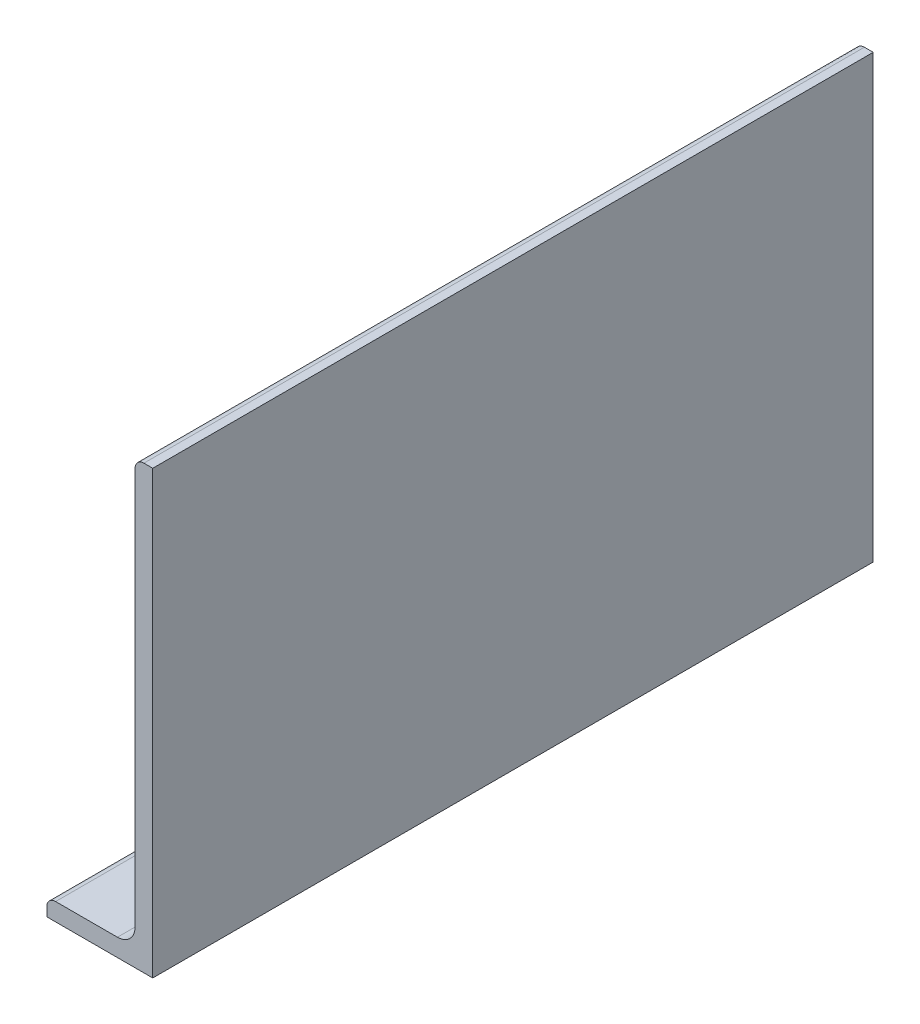
ISO-10303-21;
HEADER;
FILE_DESCRIPTION(('STEP AP214'),'2;1');
FILE_NAME('part.step','',(''),(''),'','','');
FILE_SCHEMA(('AUTOMOTIVE_DESIGN { 1 0 10303 214 1 1 1 1 }'));
ENDSEC;
DATA;
#1=APPLICATION_CONTEXT('core data for automotive mechanical design processes');
#2=APPLICATION_PROTOCOL_DEFINITION('international standard','automotive_design',2000,#1);
#3=PRODUCT_CONTEXT('',#1,'mechanical');
#4=PRODUCT('Part','Part','',(#3));
#5=PRODUCT_RELATED_PRODUCT_CATEGORY('part','',(#4));
#6=PRODUCT_DEFINITION_FORMATION('','',#4);
#7=PRODUCT_DEFINITION_CONTEXT('part definition',#1,'design');
#8=PRODUCT_DEFINITION('design','',#6,#7);
#9=PRODUCT_DEFINITION_SHAPE('','',#8);
#10=(LENGTH_UNIT() NAMED_UNIT(*) SI_UNIT(.MILLI.,.METRE.));
#11=(NAMED_UNIT(*) PLANE_ANGLE_UNIT() SI_UNIT($,.RADIAN.));
#12=(NAMED_UNIT(*) SI_UNIT($,.STERADIAN.) SOLID_ANGLE_UNIT());
#13=UNCERTAINTY_MEASURE_WITH_UNIT(LENGTH_MEASURE(1.E-05),#10,'distance_accuracy_value','');
#14=(GEOMETRIC_REPRESENTATION_CONTEXT(3) GLOBAL_UNCERTAINTY_ASSIGNED_CONTEXT((#13)) GLOBAL_UNIT_ASSIGNED_CONTEXT((#10,
#11,#12)) REPRESENTATION_CONTEXT('',''));
#15=CARTESIAN_POINT('',(0.,0.,0.));
#16=DIRECTION('',(0.,0.,1.));
#17=DIRECTION('',(1.,0.,0.));
#18=AXIS2_PLACEMENT_3D('',#15,#16,#17);
#19=CARTESIAN_POINT('',(1154.01935593196,-193.24771494514,81.6));
#20=DIRECTION('',(0.,-1.,0.));
#21=DIRECTION('',(0.,0.,-1.));
#22=AXIS2_PLACEMENT_3D('',#19,#20,#21);
#23=PLANE('',#22);
#24=DIRECTION('',(-1.,0.,0.));
#25=VECTOR('',#24,1.);
#26=CARTESIAN_POINT('',(1154.01935593196,-193.24771494514,0.));
#27=LINE('',#26,#25);
#28=CARTESIAN_POINT('',(1156.01935593196,-193.24771494514,0.));
#29=VERTEX_POINT('',#28);
#30=CARTESIAN_POINT('',(1155.01935593196,-193.24771494514,0.));
#31=VERTEX_POINT('',#30);
#32=EDGE_CURVE('E135',#29,#31,#27,.T.);
#33=ORIENTED_EDGE('',*,*,#32,.T.);
#34=DIRECTION('',(0.,0.,-1.));
#35=VECTOR('',#34,1.);
#36=CARTESIAN_POINT('',(1155.01935593196,-193.24771494514,81.6));
#37=LINE('',#36,#35);
#38=CARTESIAN_POINT('',(1155.01935593196,-193.24771494514,81.6));
#39=VERTEX_POINT('',#38);
#40=EDGE_CURVE('E167',#31,#39,#37,.F.);
#41=ORIENTED_EDGE('',*,*,#40,.T.);
#42=DIRECTION('',(-1.,0.,0.));
#43=VECTOR('',#42,1.);
#44=CARTESIAN_POINT('',(1154.01935593196,-193.24771494514,81.6));
#45=LINE('',#44,#43);
#46=CARTESIAN_POINT('',(1156.01935593196,-193.24771494514,81.6));
#47=VERTEX_POINT('',#46);
#48=EDGE_CURVE('E148',#47,#39,#45,.T.);
#49=ORIENTED_EDGE('',*,*,#48,.F.);
#50=DIRECTION('',(0.,0.,-1.));
#51=VECTOR('',#50,1.);
#52=CARTESIAN_POINT('',(1156.01935593196,-193.24771494514,81.6));
#53=LINE('',#52,#51);
#54=EDGE_CURVE('E131',#47,#29,#53,.T.);
#55=ORIENTED_EDGE('',*,*,#54,.T.);
#56=EDGE_LOOP('',(#33,#41,#49,#55));
#57=FACE_BOUND('',#56,.T.);
#58=ADVANCED_FACE('F33',(#57),#23,.F.);
#59=CARTESIAN_POINT('',(1154.01935593196,-241.24771494514,81.6));
#60=DIRECTION('',(1.,0.,0.));
#61=DIRECTION('',(0.,0.,-1.));
#62=AXIS2_PLACEMENT_3D('',#59,#60,#61);
#63=PLANE('',#62);
#64=DIRECTION('',(0.,-1.,0.));
#65=VECTOR('',#64,1.);
#66=CARTESIAN_POINT('',(1154.01935593196,-241.24771494514,0.));
#67=LINE('',#66,#65);
#68=CARTESIAN_POINT('',(1154.01935593196,-194.24771494514,0.));
#69=VERTEX_POINT('',#68);
#70=CARTESIAN_POINT('',(1154.01935593196,-239.24771494514,0.));
#71=VERTEX_POINT('',#70);
#72=EDGE_CURVE('E138',#69,#71,#67,.T.);
#73=ORIENTED_EDGE('',*,*,#72,.T.);
#74=DIRECTION('',(0.,0.,-1.));
#75=VECTOR('',#74,1.);
#76=CARTESIAN_POINT('',(1154.01935593196,-239.24771494514,81.6));
#77=LINE('',#76,#75);
#78=CARTESIAN_POINT('',(1154.01935593196,-239.24771494514,81.6));
#79=VERTEX_POINT('',#78);
#80=EDGE_CURVE('E54',#71,#79,#77,.F.);
#81=ORIENTED_EDGE('',*,*,#80,.T.);
#82=DIRECTION('',(0.,-1.,0.));
#83=VECTOR('',#82,1.);
#84=CARTESIAN_POINT('',(1154.01935593196,-241.24771494514,81.6));
#85=LINE('',#84,#83);
#86=CARTESIAN_POINT('',(1154.01935593196,-194.24771494514,81.6));
#87=VERTEX_POINT('',#86);
#88=EDGE_CURVE('E242',#87,#79,#85,.T.);
#89=ORIENTED_EDGE('',*,*,#88,.F.);
#90=DIRECTION('',(0.,0.,-1.));
#91=VECTOR('',#90,1.);
#92=CARTESIAN_POINT('',(1154.01935593196,-194.24771494514,81.6));
#93=LINE('',#92,#91);
#94=EDGE_CURVE('E164',#87,#69,#93,.T.);
#95=ORIENTED_EDGE('',*,*,#94,.T.);
#96=EDGE_LOOP('',(#73,#81,#89,#95));
#97=FACE_BOUND('',#96,.T.);
#98=ADVANCED_FACE('F194',(#97),#63,.F.);
#99=CARTESIAN_POINT('',(1144.01935593196,-241.24771494514,81.6));
#100=DIRECTION('',(0.,-1.,0.));
#101=DIRECTION('',(0.,0.,-1.));
#102=AXIS2_PLACEMENT_3D('',#99,#100,#101);
#103=PLANE('',#102);
#104=CARTESIAN_POINT('',(1148.51935593196,-241.24771494514,61.6));
#105=DIRECTION('',(0.,1.,0.));
#106=DIRECTION('',(0.,0.,1.));
#107=AXIS2_PLACEMENT_3D('',#104,#105,#106);
#108=CIRCLE('',#107,1.60000000000013);
#109=CARTESIAN_POINT('',(1148.51935593196,-241.24771494514,63.2000000000001));
#110=VERTEX_POINT('',#109);
#111=EDGE_CURVE('E230',#110,#110,#108,.T.);
#112=ORIENTED_EDGE('',*,*,#111,.F.);
#113=EDGE_LOOP('',(#112));
#114=FACE_BOUND('',#113,.T.);
#115=CARTESIAN_POINT('',(1148.51935593196,-241.24771494514,20.));
#116=DIRECTION('',(0.,1.,0.));
#117=DIRECTION('',(0.,0.,1.));
#118=AXIS2_PLACEMENT_3D('',#115,#116,#117);
#119=CIRCLE('',#118,1.60000000000013);
#120=CARTESIAN_POINT('',(1148.51935593196,-241.24771494514,21.6000000000001));
#121=VERTEX_POINT('',#120);
#122=EDGE_CURVE('E235',#121,#121,#119,.T.);
#123=ORIENTED_EDGE('',*,*,#122,.F.);
#124=EDGE_LOOP('',(#123));
#125=FACE_BOUND('',#124,.T.);
#126=DIRECTION('',(-1.,0.,0.));
#127=VECTOR('',#126,1.);
#128=CARTESIAN_POINT('',(1144.01935593196,-241.24771494514,81.6));
#129=LINE('',#128,#127);
#130=CARTESIAN_POINT('',(1152.01935593196,-241.24771494514,81.6));
#131=VERTEX_POINT('',#130);
#132=CARTESIAN_POINT('',(1145.01935593196,-241.24771494514,81.6));
#133=VERTEX_POINT('',#132);
#134=EDGE_CURVE('E114',#131,#133,#129,.T.);
#135=ORIENTED_EDGE('',*,*,#134,.F.);
#136=DIRECTION('',(0.,0.,-1.));
#137=VECTOR('',#136,1.);
#138=CARTESIAN_POINT('',(1152.01935593196,-241.24771494514,0.));
#139=LINE('',#138,#137);
#140=CARTESIAN_POINT('',(1152.01935593196,-241.24771494514,0.));
#141=VERTEX_POINT('',#140);
#142=EDGE_CURVE('E169',#131,#141,#139,.T.);
#143=ORIENTED_EDGE('',*,*,#142,.T.);
#144=DIRECTION('',(-1.,0.,0.));
#145=VECTOR('',#144,1.);
#146=CARTESIAN_POINT('',(1144.01935593196,-241.24771494514,0.));
#147=LINE('',#146,#145);
#148=CARTESIAN_POINT('',(1145.01935593196,-241.24771494514,0.));
#149=VERTEX_POINT('',#148);
#150=EDGE_CURVE('E141',#141,#149,#147,.T.);
#151=ORIENTED_EDGE('',*,*,#150,.T.);
#152=DIRECTION('',(0.,0.,-1.));
#153=VECTOR('',#152,1.);
#154=CARTESIAN_POINT('',(1145.01935593196,-241.24771494514,81.6));
#155=LINE('',#154,#153);
#156=EDGE_CURVE('E158',#149,#133,#155,.F.);
#157=ORIENTED_EDGE('',*,*,#156,.T.);
#158=EDGE_LOOP('',(#135,#143,#151,#157));
#159=FACE_BOUND('',#158,.T.);
#160=ADVANCED_FACE('F175',(#114,#125,#159),#103,.F.);
#161=CARTESIAN_POINT('',(1144.01935593196,-243.24771494514,81.6));
#162=DIRECTION('',(1.,0.,0.));
#163=DIRECTION('',(0.,0.,-1.));
#164=AXIS2_PLACEMENT_3D('',#161,#162,#163);
#165=PLANE('',#164);
#166=DIRECTION('',(0.,-1.,0.));
#167=VECTOR('',#166,1.);
#168=CARTESIAN_POINT('',(1144.01935593196,-243.24771494514,81.6));
#169=LINE('',#168,#167);
#170=CARTESIAN_POINT('',(1144.01935593196,-242.24771494514,81.6));
#171=VERTEX_POINT('',#170);
#172=CARTESIAN_POINT('',(1144.01935593196,-243.24771494514,81.6));
#173=VERTEX_POINT('',#172);
#174=EDGE_CURVE('E103',#171,#173,#169,.T.);
#175=ORIENTED_EDGE('',*,*,#174,.F.);
#176=DIRECTION('',(0.,0.,-1.));
#177=VECTOR('',#176,1.);
#178=CARTESIAN_POINT('',(1144.01935593196,-242.24771494514,81.6));
#179=LINE('',#178,#177);
#180=CARTESIAN_POINT('',(1144.01935593196,-242.24771494514,0.));
#181=VERTEX_POINT('',#180);
#182=EDGE_CURVE('E123',#171,#181,#179,.T.);
#183=ORIENTED_EDGE('',*,*,#182,.T.);
#184=DIRECTION('',(0.,-1.,0.));
#185=VECTOR('',#184,1.);
#186=CARTESIAN_POINT('',(1144.01935593196,-243.24771494514,0.));
#187=LINE('',#186,#185);
#188=CARTESIAN_POINT('',(1144.01935593196,-243.24771494514,0.));
#189=VERTEX_POINT('',#188);
#190=EDGE_CURVE('E120',#181,#189,#187,.T.);
#191=ORIENTED_EDGE('',*,*,#190,.T.);
#192=DIRECTION('',(0.,0.,-1.));
#193=VECTOR('',#192,1.);
#194=CARTESIAN_POINT('',(1144.01935593196,-243.24771494514,81.6));
#195=LINE('',#194,#193);
#196=EDGE_CURVE('E117',#173,#189,#195,.T.);
#197=ORIENTED_EDGE('',*,*,#196,.F.);
#198=EDGE_LOOP('',(#175,#183,#191,#197));
#199=FACE_BOUND('',#198,.T.);
#200=ADVANCED_FACE('F118',(#199),#165,.F.);
#201=CARTESIAN_POINT('',(1156.01935593196,-243.24771494514,81.6));
#202=DIRECTION('',(0.,1.,0.));
#203=DIRECTION('',(0.,0.,1.));
#204=AXIS2_PLACEMENT_3D('',#201,#202,#203);
#205=PLANE('',#204);
#206=CARTESIAN_POINT('',(1148.51935593196,-243.24771494514,61.6));
#207=DIRECTION('',(0.,1.,0.));
#208=DIRECTION('',(0.,0.,1.));
#209=AXIS2_PLACEMENT_3D('',#206,#207,#208);
#210=CIRCLE('',#209,1.60000000000013);
#211=CARTESIAN_POINT('',(1148.51935593196,-243.24771494514,63.2000000000001));
#212=VERTEX_POINT('',#211);
#213=EDGE_CURVE('E139',#212,#212,#210,.T.);
#214=ORIENTED_EDGE('',*,*,#213,.T.);
#215=EDGE_LOOP('',(#214));
#216=FACE_BOUND('',#215,.T.);
#217=CARTESIAN_POINT('',(1148.51935593196,-243.24771494514,20.));
#218=DIRECTION('',(0.,1.,0.));
#219=DIRECTION('',(0.,0.,1.));
#220=AXIS2_PLACEMENT_3D('',#217,#218,#219);
#221=CIRCLE('',#220,1.60000000000013);
#222=CARTESIAN_POINT('',(1148.51935593196,-243.24771494514,21.6000000000001));
#223=VERTEX_POINT('',#222);
#224=EDGE_CURVE('E231',#223,#223,#221,.T.);
#225=ORIENTED_EDGE('',*,*,#224,.T.);
#226=EDGE_LOOP('',(#225));
#227=FACE_BOUND('',#226,.T.);
#228=DIRECTION('',(1.,0.,0.));
#229=VECTOR('',#228,1.);
#230=CARTESIAN_POINT('',(1156.01935593196,-243.24771494514,0.));
#231=LINE('',#230,#229);
#232=CARTESIAN_POINT('',(1156.01935593196,-243.24771494514,0.));
#233=VERTEX_POINT('',#232);
#234=EDGE_CURVE('E144',#189,#233,#231,.T.);
#235=ORIENTED_EDGE('',*,*,#234,.T.);
#236=DIRECTION('',(0.,0.,-1.));
#237=VECTOR('',#236,1.);
#238=CARTESIAN_POINT('',(1156.01935593196,-243.24771494514,81.6));
#239=LINE('',#238,#237);
#240=CARTESIAN_POINT('',(1156.01935593196,-243.24771494514,81.6));
#241=VERTEX_POINT('',#240);
#242=EDGE_CURVE('E124',#241,#233,#239,.T.);
#243=ORIENTED_EDGE('',*,*,#242,.F.);
#244=DIRECTION('',(1.,0.,0.));
#245=VECTOR('',#244,1.);
#246=CARTESIAN_POINT('',(1156.01935593196,-243.24771494514,81.6));
#247=LINE('',#246,#245);
#248=EDGE_CURVE('E107',#173,#241,#247,.T.);
#249=ORIENTED_EDGE('',*,*,#248,.F.);
#250=ORIENTED_EDGE('',*,*,#196,.T.);
#251=EDGE_LOOP('',(#235,#243,#249,#250));
#252=FACE_BOUND('',#251,.T.);
#253=ADVANCED_FACE('F126',(#216,#227,#252),#205,.F.);
#254=CARTESIAN_POINT('',(1156.01935593196,-193.24771494514,81.6));
#255=DIRECTION('',(-1.,0.,0.));
#256=DIRECTION('',(0.,0.,1.));
#257=AXIS2_PLACEMENT_3D('',#254,#255,#256);
#258=PLANE('',#257);
#259=DIRECTION('',(0.,1.,0.));
#260=VECTOR('',#259,1.);
#261=CARTESIAN_POINT('',(1156.01935593196,-193.24771494514,0.));
#262=LINE('',#261,#260);
#263=EDGE_CURVE('E146',#233,#29,#262,.T.);
#264=ORIENTED_EDGE('',*,*,#263,.T.);
#265=ORIENTED_EDGE('',*,*,#54,.F.);
#266=DIRECTION('',(0.,1.,0.));
#267=VECTOR('',#266,1.);
#268=CARTESIAN_POINT('',(1156.01935593196,-193.24771494514,81.6));
#269=LINE('',#268,#267);
#270=EDGE_CURVE('E129',#241,#47,#269,.T.);
#271=ORIENTED_EDGE('',*,*,#270,.F.);
#272=ORIENTED_EDGE('',*,*,#242,.T.);
#273=EDGE_LOOP('',(#264,#265,#271,#272));
#274=FACE_BOUND('',#273,.T.);
#275=ADVANCED_FACE('F209',(#274),#258,.F.);
#276=CARTESIAN_POINT('',(0.,0.,81.6));
#277=DIRECTION('',(0.,0.,-1.));
#278=DIRECTION('',(-1.,0.,0.));
#279=AXIS2_PLACEMENT_3D('',#276,#277,#278);
#280=PLANE('',#279);
#281=ORIENTED_EDGE('',*,*,#88,.T.);
#282=CARTESIAN_POINT('',(1152.01935593196,-239.24771494514,81.6));
#283=DIRECTION('',(0.,0.,-1.));
#284=DIRECTION('',(-1.,0.,0.));
#285=AXIS2_PLACEMENT_3D('',#282,#283,#284);
#286=CIRCLE('',#285,2.);
#287=EDGE_CURVE('E11',#79,#131,#286,.T.);
#288=ORIENTED_EDGE('',*,*,#287,.T.);
#289=ORIENTED_EDGE('',*,*,#134,.T.);
#290=CARTESIAN_POINT('',(1145.01935593196,-242.24771494514,81.6));
#291=DIRECTION('',(0.,0.,-1.));
#292=DIRECTION('',(-1.,0.,0.));
#293=AXIS2_PLACEMENT_3D('',#290,#291,#292);
#294=CIRCLE('',#293,1.);
#295=EDGE_CURVE('E110',#133,#171,#294,.F.);
#296=ORIENTED_EDGE('',*,*,#295,.T.);
#297=ORIENTED_EDGE('',*,*,#174,.T.);
#298=ORIENTED_EDGE('',*,*,#248,.T.);
#299=ORIENTED_EDGE('',*,*,#270,.T.);
#300=ORIENTED_EDGE('',*,*,#48,.T.);
#301=CARTESIAN_POINT('',(1155.01935593196,-194.24771494514,81.6));
#302=DIRECTION('',(0.,0.,-1.));
#303=DIRECTION('',(-1.,0.,0.));
#304=AXIS2_PLACEMENT_3D('',#301,#302,#303);
#305=CIRCLE('',#304,1.);
#306=EDGE_CURVE('E161',#39,#87,#305,.F.);
#307=ORIENTED_EDGE('',*,*,#306,.T.);
#308=EDGE_LOOP('',(#281,#288,#289,#296,#297,#298,#299,#300,#307));
#309=FACE_BOUND('',#308,.T.);
#310=ADVANCED_FACE('F105',(#309),#280,.F.);
#311=CARTESIAN_POINT('',(0.,0.,0.));
#312=DIRECTION('',(0.,0.,-1.));
#313=DIRECTION('',(-1.,0.,0.));
#314=AXIS2_PLACEMENT_3D('',#311,#312,#313);
#315=PLANE('',#314);
#316=ORIENTED_EDGE('',*,*,#190,.F.);
#317=CARTESIAN_POINT('',(1145.01935593196,-242.24771494514,0.));
#318=DIRECTION('',(0.,0.,-1.));
#319=DIRECTION('',(-1.,0.,0.));
#320=AXIS2_PLACEMENT_3D('',#317,#318,#319);
#321=CIRCLE('',#320,1.);
#322=EDGE_CURVE('E155',#181,#149,#321,.T.);
#323=ORIENTED_EDGE('',*,*,#322,.T.);
#324=ORIENTED_EDGE('',*,*,#150,.F.);
#325=CARTESIAN_POINT('',(1152.01935593196,-239.24771494514,0.));
#326=DIRECTION('',(0.,0.,-1.));
#327=DIRECTION('',(-1.,0.,0.));
#328=AXIS2_PLACEMENT_3D('',#325,#326,#327);
#329=CIRCLE('',#328,2.);
#330=EDGE_CURVE('E41',#141,#71,#329,.F.);
#331=ORIENTED_EDGE('',*,*,#330,.T.);
#332=ORIENTED_EDGE('',*,*,#72,.F.);
#333=CARTESIAN_POINT('',(1155.01935593196,-194.24771494514,0.));
#334=DIRECTION('',(0.,0.,-1.));
#335=DIRECTION('',(-1.,0.,0.));
#336=AXIS2_PLACEMENT_3D('',#333,#334,#335);
#337=CIRCLE('',#336,1.);
#338=EDGE_CURVE('E153',#69,#31,#337,.T.);
#339=ORIENTED_EDGE('',*,*,#338,.T.);
#340=ORIENTED_EDGE('',*,*,#32,.F.);
#341=ORIENTED_EDGE('',*,*,#263,.F.);
#342=ORIENTED_EDGE('',*,*,#234,.F.);
#343=EDGE_LOOP('',(#316,#323,#324,#331,#332,#339,#340,#341,#342));
#344=FACE_BOUND('',#343,.T.);
#345=ADVANCED_FACE('F178',(#344),#315,.T.);
#346=CARTESIAN_POINT('',(1145.01935593196,-242.24771494514,81.6));
#347=DIRECTION('',(0.,0.,-1.));
#348=DIRECTION('',(-1.,0.,0.));
#349=AXIS2_PLACEMENT_3D('',#346,#347,#348);
#350=CYLINDRICAL_SURFACE('',#349,1.);
#351=ORIENTED_EDGE('',*,*,#295,.F.);
#352=ORIENTED_EDGE('',*,*,#156,.F.);
#353=ORIENTED_EDGE('',*,*,#322,.F.);
#354=ORIENTED_EDGE('',*,*,#182,.F.);
#355=EDGE_LOOP('',(#351,#352,#353,#354));
#356=FACE_BOUND('',#355,.T.);
#357=ADVANCED_FACE('F181',(#356),#350,.T.);
#358=CARTESIAN_POINT('',(1155.01935593196,-194.24771494514,81.6));
#359=DIRECTION('',(0.,0.,-1.));
#360=DIRECTION('',(-1.,0.,0.));
#361=AXIS2_PLACEMENT_3D('',#358,#359,#360);
#362=CYLINDRICAL_SURFACE('',#361,1.);
#363=ORIENTED_EDGE('',*,*,#306,.F.);
#364=ORIENTED_EDGE('',*,*,#40,.F.);
#365=ORIENTED_EDGE('',*,*,#338,.F.);
#366=ORIENTED_EDGE('',*,*,#94,.F.);
#367=EDGE_LOOP('',(#363,#364,#365,#366));
#368=FACE_BOUND('',#367,.T.);
#369=ADVANCED_FACE('F183',(#368),#362,.T.);
#370=CARTESIAN_POINT('',(1152.01935593196,-239.24771494514,81.6));
#371=DIRECTION('',(0.,0.,1.));
#372=DIRECTION('',(1.,0.,0.));
#373=AXIS2_PLACEMENT_3D('',#370,#371,#372);
#374=CYLINDRICAL_SURFACE('',#373,2.);
#375=ORIENTED_EDGE('',*,*,#287,.F.);
#376=ORIENTED_EDGE('',*,*,#80,.F.);
#377=ORIENTED_EDGE('',*,*,#330,.F.);
#378=ORIENTED_EDGE('',*,*,#142,.F.);
#379=EDGE_LOOP('',(#375,#376,#377,#378));
#380=FACE_BOUND('',#379,.T.);
#381=ADVANCED_FACE('F35',(#380),#374,.F.);
#382=CARTESIAN_POINT('',(1148.51935593196,-243.24771494514,20.));
#383=DIRECTION('',(0.,1.,0.));
#384=DIRECTION('',(0.,0.,1.));
#385=AXIS2_PLACEMENT_3D('',#382,#383,#384);
#386=CYLINDRICAL_SURFACE('',#385,1.60000000000013);
#387=ORIENTED_EDGE('',*,*,#224,.F.);
#388=EDGE_LOOP('',(#387));
#389=FACE_BOUND('',#388,.T.);
#390=ORIENTED_EDGE('',*,*,#122,.T.);
#391=EDGE_LOOP('',(#390));
#392=FACE_BOUND('',#391,.T.);
#393=ADVANCED_FACE('F216',(#389,#392),#386,.F.);
#394=CARTESIAN_POINT('',(1148.51935593196,-243.24771494514,61.6));
#395=DIRECTION('',(0.,1.,0.));
#396=DIRECTION('',(0.,0.,1.));
#397=AXIS2_PLACEMENT_3D('',#394,#395,#396);
#398=CYLINDRICAL_SURFACE('',#397,1.60000000000013);
#399=ORIENTED_EDGE('',*,*,#213,.F.);
#400=EDGE_LOOP('',(#399));
#401=FACE_BOUND('',#400,.T.);
#402=ORIENTED_EDGE('',*,*,#111,.T.);
#403=EDGE_LOOP('',(#402));
#404=FACE_BOUND('',#403,.T.);
#405=ADVANCED_FACE('F219',(#401,#404),#398,.F.);
#406=CLOSED_SHELL('',(#58,#98,#160,#200,#253,#275,#310,#345,#357,#369,#381,#393,#405));
#407=MANIFOLD_SOLID_BREP('B2',#406);
#408=ADVANCED_BREP_SHAPE_REPRESENTATION('',(#18,#407),#14);
#409=SHAPE_DEFINITION_REPRESENTATION(#9,#408);
ENDSEC;
END-ISO-10303-21;
